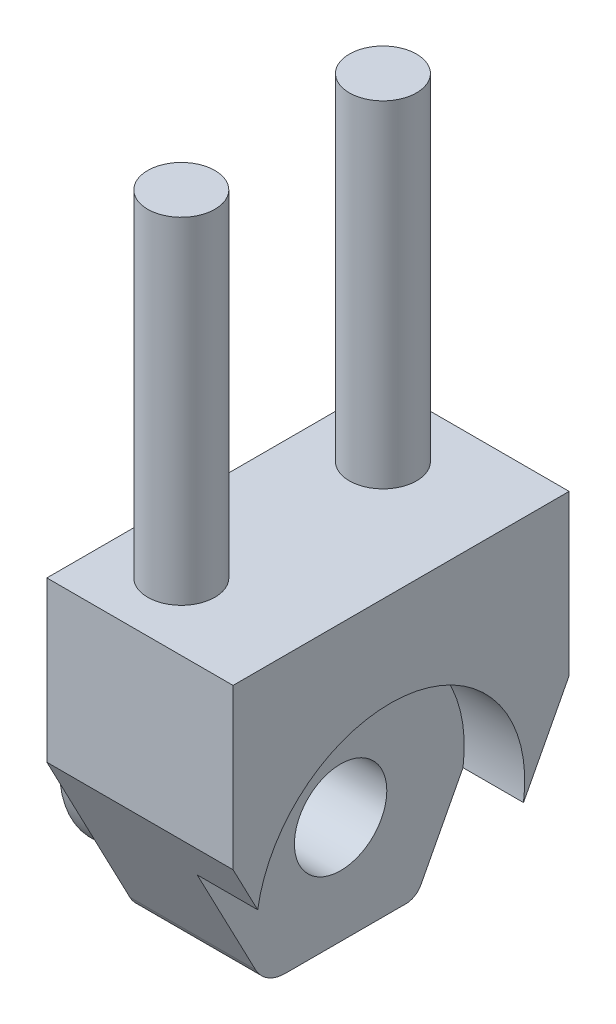
ISO-10303-21;
HEADER;
FILE_DESCRIPTION(('STEP AP214'),'2;1');
FILE_NAME('part.step','',(''),(''),'','','');
FILE_SCHEMA(('AUTOMOTIVE_DESIGN { 1 0 10303 214 1 1 1 1 }'));
ENDSEC;
DATA;
#1=APPLICATION_CONTEXT('core data for automotive mechanical design processes');
#2=APPLICATION_PROTOCOL_DEFINITION('international standard','automotive_design',2000,#1);
#3=PRODUCT_CONTEXT('',#1,'mechanical');
#4=PRODUCT('Part','Part','',(#3));
#5=PRODUCT_RELATED_PRODUCT_CATEGORY('part','',(#4));
#6=PRODUCT_DEFINITION_FORMATION('','',#4);
#7=PRODUCT_DEFINITION_CONTEXT('part definition',#1,'design');
#8=PRODUCT_DEFINITION('design','',#6,#7);
#9=PRODUCT_DEFINITION_SHAPE('','',#8);
#10=(LENGTH_UNIT() NAMED_UNIT(*) SI_UNIT(.MILLI.,.METRE.));
#11=(NAMED_UNIT(*) PLANE_ANGLE_UNIT() SI_UNIT($,.RADIAN.));
#12=(NAMED_UNIT(*) SI_UNIT($,.STERADIAN.) SOLID_ANGLE_UNIT());
#13=UNCERTAINTY_MEASURE_WITH_UNIT(LENGTH_MEASURE(1.E-05),#10,'distance_accuracy_value','');
#14=(GEOMETRIC_REPRESENTATION_CONTEXT(3) GLOBAL_UNCERTAINTY_ASSIGNED_CONTEXT((#13)) GLOBAL_UNIT_ASSIGNED_CONTEXT((#10,
#11,#12)) REPRESENTATION_CONTEXT('',''));
#15=CARTESIAN_POINT('',(0.,0.,0.));
#16=DIRECTION('',(0.,0.,1.));
#17=DIRECTION('',(1.,0.,0.));
#18=AXIS2_PLACEMENT_3D('',#15,#16,#17);
#19=CARTESIAN_POINT('',(30.7741068663053,12.8,1.65080050703637));
#20=DIRECTION('',(1.,0.,0.));
#21=DIRECTION('',(0.,0.,-1.));
#22=AXIS2_PLACEMENT_3D('',#19,#20,#21);
#23=PLANE('',#22);
#24=DIRECTION('',(0.,0.,-1.));
#25=VECTOR('',#24,1.);
#26=CARTESIAN_POINT('',(30.7741068663053,0.,0.));
#27=LINE('',#26,#25);
#28=CARTESIAN_POINT('',(30.7741068663053,0.,6.94763686889959));
#29=VERTEX_POINT('',#28);
#30=CARTESIAN_POINT('',(30.7741068663053,0.,-7.42192336474054));
#31=VERTEX_POINT('',#30);
#32=EDGE_CURVE('E177',#29,#31,#27,.T.);
#33=ORIENTED_EDGE('',*,*,#32,.T.);
#34=CARTESIAN_POINT('',(30.7741068663053,2.,-7.42192336474054));
#35=DIRECTION('',(1.,0.,0.));
#36=DIRECTION('',(0.,0.,-1.));
#37=AXIS2_PLACEMENT_3D('',#34,#35,#36);
#38=CIRCLE('',#37,2.);
#39=CARTESIAN_POINT('',(30.7741068663053,1.07198601065888,-9.19358643530085));
#40=VERTEX_POINT('',#39);
#41=EDGE_CURVE('E58',#31,#40,#38,.T.);
#42=ORIENTED_EDGE('',*,*,#41,.T.);
#43=DIRECTION('',(0.,0.885831535280156,-0.464006994670556));
#44=VECTOR('',#43,1.);
#45=CARTESIAN_POINT('',(30.7741068663053,21.0000000000001,-19.6320699535272));
#46=LINE('',#45,#44);
#47=CARTESIAN_POINT('',(30.7741068663053,10.6330959486494,-14.2017868790101));
#48=VERTEX_POINT('',#47);
#49=EDGE_CURVE('E132',#48,#40,#46,.F.);
#50=ORIENTED_EDGE('',*,*,#49,.F.);
#51=CARTESIAN_POINT('',(30.7741068663053,12.8,1.65080050703637));
#52=DIRECTION('',(1.,0.,0.));
#53=DIRECTION('',(0.,0.,-1.));
#54=AXIS2_PLACEMENT_3D('',#51,#52,#53);
#55=CIRCLE('',#54,16.);
#56=CARTESIAN_POINT('',(30.7741068663053,15.4051410884042,17.4372896642083));
#57=VERTEX_POINT('',#56);
#58=EDGE_CURVE('E121',#48,#57,#55,.T.);
#59=ORIENTED_EDGE('',*,*,#58,.T.);
#60=DIRECTION('',(0.,-0.885831535280157,-0.464006994670556));
#61=VECTOR('',#60,1.);
#62=CARTESIAN_POINT('',(30.7741068663053,21.0000000000001,20.3679300464728));
#63=LINE('',#62,#61);
#64=CARTESIAN_POINT('',(30.7741068663053,2.14397202131778,10.4909630100202));
#65=VERTEX_POINT('',#64);
#66=EDGE_CURVE('E130',#65,#57,#63,.F.);
#67=ORIENTED_EDGE('',*,*,#66,.F.);
#68=CARTESIAN_POINT('',(30.7741068663053,4.,6.94763686889959));
#69=DIRECTION('',(1.,0.,0.));
#70=DIRECTION('',(0.,0.,-1.));
#71=AXIS2_PLACEMENT_3D('',#68,#69,#70);
#72=CIRCLE('',#71,4.);
#73=EDGE_CURVE('E164',#29,#65,#72,.F.);
#74=ORIENTED_EDGE('',*,*,#73,.F.);
#75=EDGE_LOOP('',(#33,#42,#50,#59,#67,#74));
#76=FACE_BOUND('',#75,.T.);
#77=CARTESIAN_POINT('',(30.7741068663053,12.8,0.367930046472828));
#78=DIRECTION('',(1.,0.,0.));
#79=DIRECTION('',(0.,0.,-1.));
#80=AXIS2_PLACEMENT_3D('',#77,#78,#79);
#81=CIRCLE('',#80,5.5);
#82=CARTESIAN_POINT('',(30.7741068663053,12.8,-5.13206995352717));
#83=VERTEX_POINT('',#82);
#84=EDGE_CURVE('E39',#83,#83,#81,.F.);
#85=ORIENTED_EDGE('',*,*,#84,.T.);
#86=EDGE_LOOP('',(#85));
#87=FACE_BOUND('',#86,.T.);
#88=ADVANCED_FACE('F35',(#76,#87),#23,.T.);
#89=CARTESIAN_POINT('',(0.,0.,0.));
#90=DIRECTION('',(0.,1.,0.));
#91=DIRECTION('',(0.,0.,1.));
#92=AXIS2_PLACEMENT_3D('',#89,#90,#91);
#93=PLANE('',#92);
#94=DIRECTION('',(0.,0.,1.));
#95=VECTOR('',#94,1.);
#96=CARTESIAN_POINT('',(15.8141068663053,0.,-19.6320699535272));
#97=LINE('',#96,#95);
#98=CARTESIAN_POINT('',(15.8141068663053,0.,-7.42192336474054));
#99=VERTEX_POINT('',#98);
#100=CARTESIAN_POINT('',(15.8141068663053,0.,6.94763686889959));
#101=VERTEX_POINT('',#100);
#102=EDGE_CURVE('E179',#99,#101,#97,.T.);
#103=ORIENTED_EDGE('',*,*,#102,.F.);
#104=DIRECTION('',(-1.,0.,0.));
#105=VECTOR('',#104,1.);
#106=CARTESIAN_POINT('',(30.7741068663053,0.,-7.42192336474054));
#107=LINE('',#106,#105);
#108=EDGE_CURVE('E168',#99,#31,#107,.F.);
#109=ORIENTED_EDGE('',*,*,#108,.T.);
#110=ORIENTED_EDGE('',*,*,#32,.F.);
#111=DIRECTION('',(1.,0.,0.));
#112=VECTOR('',#111,1.);
#113=CARTESIAN_POINT('',(15.8141068663053,0.,6.94763686889959));
#114=LINE('',#113,#112);
#115=EDGE_CURVE('E154',#29,#101,#114,.F.);
#116=ORIENTED_EDGE('',*,*,#115,.T.);
#117=EDGE_LOOP('',(#103,#109,#110,#116));
#118=FACE_BOUND('',#117,.T.);
#119=ADVANCED_FACE('F176',(#118),#93,.F.);
#120=CARTESIAN_POINT('',(15.8141068663053,21.0000000000001,-19.6320699535272));
#121=DIRECTION('',(0.,0.464006994670556,0.885831535280156));
#122=DIRECTION('',(-1.,0.,0.));
#123=AXIS2_PLACEMENT_3D('',#120,#121,#122);
#124=PLANE('',#123);
#125=ORIENTED_EDGE('',*,*,#49,.T.);
#126=DIRECTION('',(1.,0.,0.));
#127=VECTOR('',#126,1.);
#128=CARTESIAN_POINT('',(15.8141068663053,1.07198601065889,-9.19358643530085));
#129=LINE('',#128,#127);
#130=CARTESIAN_POINT('',(15.8141068663053,1.07198601065888,-9.19358643530085));
#131=VERTEX_POINT('',#130);
#132=EDGE_CURVE('E44',#40,#131,#129,.F.);
#133=ORIENTED_EDGE('',*,*,#132,.T.);
#134=DIRECTION('',(0.,0.885831535280156,-0.464006994670556));
#135=VECTOR('',#134,1.);
#136=CARTESIAN_POINT('',(15.8141068663053,21.0000000000001,-19.6320699535272));
#137=LINE('',#136,#135);
#138=CARTESIAN_POINT('',(15.8141068663053,21.0000000000001,-19.6320699535272));
#139=VERTEX_POINT('',#138);
#140=EDGE_CURVE('E150',#139,#131,#137,.F.);
#141=ORIENTED_EDGE('',*,*,#140,.F.);
#142=DIRECTION('',(-1.,0.,0.));
#143=VECTOR('',#142,1.);
#144=CARTESIAN_POINT('',(15.8141068663053,21.0000000000001,-19.6320699535272));
#145=LINE('',#144,#143);
#146=CARTESIAN_POINT('',(37.9741068663053,21.0000000000001,-19.6320699535272));
#147=VERTEX_POINT('',#146);
#148=EDGE_CURVE('E142',#147,#139,#145,.T.);
#149=ORIENTED_EDGE('',*,*,#148,.F.);
#150=DIRECTION('',(0.,-0.885831535280156,0.464006994670556));
#151=VECTOR('',#150,1.);
#152=CARTESIAN_POINT('',(37.9741068663053,21.0000000000001,-19.6320699535272));
#153=LINE('',#152,#151);
#154=CARTESIAN_POINT('',(37.9741068663053,10.6330959486494,-14.2017868790101));
#155=VERTEX_POINT('',#154);
#156=EDGE_CURVE('E152',#155,#147,#153,.F.);
#157=ORIENTED_EDGE('',*,*,#156,.F.);
#158=DIRECTION('',(1.,0.,0.));
#159=VECTOR('',#158,1.);
#160=CARTESIAN_POINT('',(30.7741068663053,10.6330959486494,-14.2017868790101));
#161=LINE('',#160,#159);
#162=EDGE_CURVE('E117',#48,#155,#161,.T.);
#163=ORIENTED_EDGE('',*,*,#162,.F.);
#164=EDGE_LOOP('',(#125,#133,#141,#149,#157,#163));
#165=FACE_BOUND('',#164,.T.);
#166=ADVANCED_FACE('F246',(#165),#124,.F.);
#167=CARTESIAN_POINT('',(37.9741068663053,40.,-19.6320699535272));
#168=DIRECTION('',(-1.,0.,0.));
#169=DIRECTION('',(0.,0.,1.));
#170=AXIS2_PLACEMENT_3D('',#167,#168,#169);
#171=PLANE('',#170);
#172=DIRECTION('',(0.,0.885831535280157,0.464006994670556));
#173=VECTOR('',#172,1.);
#174=CARTESIAN_POINT('',(37.9741068663053,21.0000000000001,20.3679300464728));
#175=LINE('',#174,#173);
#176=CARTESIAN_POINT('',(37.9741068663053,21.0000000000002,20.3679300464728));
#177=VERTEX_POINT('',#176);
#178=CARTESIAN_POINT('',(37.9741068663053,15.4051410884042,17.4372896642083));
#179=VERTEX_POINT('',#178);
#180=EDGE_CURVE('E127',#177,#179,#175,.F.);
#181=ORIENTED_EDGE('',*,*,#180,.T.);
#182=CARTESIAN_POINT('',(37.9741068663053,12.8,1.65080050703637));
#183=DIRECTION('',(1.,0.,0.));
#184=DIRECTION('',(0.,0.,-1.));
#185=AXIS2_PLACEMENT_3D('',#182,#183,#184);
#186=CIRCLE('',#185,16.);
#187=EDGE_CURVE('E110',#155,#179,#186,.T.);
#188=ORIENTED_EDGE('',*,*,#187,.F.);
#189=ORIENTED_EDGE('',*,*,#156,.T.);
#190=DIRECTION('',(0.,-1.,0.));
#191=VECTOR('',#190,1.);
#192=CARTESIAN_POINT('',(37.9741068663053,40.,-19.6320699535272));
#193=LINE('',#192,#191);
#194=CARTESIAN_POINT('',(37.9741068663053,40.,-19.6320699535272));
#195=VERTEX_POINT('',#194);
#196=EDGE_CURVE('E214',#195,#147,#193,.T.);
#197=ORIENTED_EDGE('',*,*,#196,.F.);
#198=DIRECTION('',(0.,0.,-1.));
#199=VECTOR('',#198,1.);
#200=CARTESIAN_POINT('',(37.9741068663053,40.,-19.6320699535272));
#201=LINE('',#200,#199);
#202=CARTESIAN_POINT('',(37.9741068663053,40.,20.3679300464728));
#203=VERTEX_POINT('',#202);
#204=EDGE_CURVE('E206',#203,#195,#201,.T.);
#205=ORIENTED_EDGE('',*,*,#204,.F.);
#206=DIRECTION('',(0.,-1.,0.));
#207=VECTOR('',#206,1.);
#208=CARTESIAN_POINT('',(37.9741068663053,40.,20.3679300464728));
#209=LINE('',#208,#207);
#210=EDGE_CURVE('E138',#203,#177,#209,.T.);
#211=ORIENTED_EDGE('',*,*,#210,.T.);
#212=EDGE_LOOP('',(#181,#188,#189,#197,#205,#211));
#213=FACE_BOUND('',#212,.T.);
#214=ADVANCED_FACE('F135',(#213),#171,.F.);
#215=CARTESIAN_POINT('',(0.,4.,6.94763686889959));
#216=DIRECTION('',(-1.,0.,0.));
#217=DIRECTION('',(0.,0.,1.));
#218=AXIS2_PLACEMENT_3D('',#215,#216,#217);
#219=CYLINDRICAL_SURFACE('',#218,4.);
#220=ORIENTED_EDGE('',*,*,#115,.F.);
#221=ORIENTED_EDGE('',*,*,#73,.T.);
#222=DIRECTION('',(-1.,0.,0.));
#223=VECTOR('',#222,1.);
#224=CARTESIAN_POINT('',(37.9741068663053,2.14397202131778,10.4909630100202));
#225=LINE('',#224,#223);
#226=CARTESIAN_POINT('',(15.8141068663053,2.14397202131777,10.4909630100202));
#227=VERTEX_POINT('',#226);
#228=EDGE_CURVE('E159',#227,#65,#225,.F.);
#229=ORIENTED_EDGE('',*,*,#228,.F.);
#230=CARTESIAN_POINT('',(15.8141068663053,4.,6.94763686889959));
#231=DIRECTION('',(1.,0.,0.));
#232=DIRECTION('',(0.,0.,-1.));
#233=AXIS2_PLACEMENT_3D('',#230,#231,#232);
#234=CIRCLE('',#233,4.);
#235=EDGE_CURVE('E157',#101,#227,#234,.F.);
#236=ORIENTED_EDGE('',*,*,#235,.F.);
#237=EDGE_LOOP('',(#220,#221,#229,#236));
#238=FACE_BOUND('',#237,.T.);
#239=ADVANCED_FACE('F227',(#238),#219,.T.);
#240=CARTESIAN_POINT('',(15.8141068663053,40.,-19.6320699535272));
#241=DIRECTION('',(1.,0.,0.));
#242=DIRECTION('',(0.,0.,-1.));
#243=AXIS2_PLACEMENT_3D('',#240,#241,#242);
#244=PLANE('',#243);
#245=ORIENTED_EDGE('',*,*,#140,.T.);
#246=CARTESIAN_POINT('',(15.8141068663053,2.,-7.42192336474054));
#247=DIRECTION('',(1.,0.,0.));
#248=DIRECTION('',(0.,0.,-1.));
#249=AXIS2_PLACEMENT_3D('',#246,#247,#248);
#250=CIRCLE('',#249,2.);
#251=EDGE_CURVE('E11',#131,#99,#250,.F.);
#252=ORIENTED_EDGE('',*,*,#251,.T.);
#253=ORIENTED_EDGE('',*,*,#102,.T.);
#254=ORIENTED_EDGE('',*,*,#235,.T.);
#255=DIRECTION('',(0.,-0.885831535280157,-0.464006994670556));
#256=VECTOR('',#255,1.);
#257=CARTESIAN_POINT('',(15.8141068663053,21.0000000000001,20.3679300464728));
#258=LINE('',#257,#256);
#259=CARTESIAN_POINT('',(15.8141068663053,21.0000000000002,20.3679300464728));
#260=VERTEX_POINT('',#259);
#261=EDGE_CURVE('E139',#227,#260,#258,.F.);
#262=ORIENTED_EDGE('',*,*,#261,.T.);
#263=DIRECTION('',(0.,-1.,0.));
#264=VECTOR('',#263,1.);
#265=CARTESIAN_POINT('',(15.8141068663053,40.,20.3679300464728));
#266=LINE('',#265,#264);
#267=CARTESIAN_POINT('',(15.8141068663053,40.,20.3679300464728));
#268=VERTEX_POINT('',#267);
#269=EDGE_CURVE('E144',#268,#260,#266,.T.);
#270=ORIENTED_EDGE('',*,*,#269,.F.);
#271=DIRECTION('',(0.,0.,1.));
#272=VECTOR('',#271,1.);
#273=CARTESIAN_POINT('',(15.8141068663053,40.,-19.6320699535272));
#274=LINE('',#273,#272);
#275=CARTESIAN_POINT('',(15.8141068663053,40.,-19.6320699535272));
#276=VERTEX_POINT('',#275);
#277=EDGE_CURVE('E201',#276,#268,#274,.T.);
#278=ORIENTED_EDGE('',*,*,#277,.F.);
#279=DIRECTION('',(0.,-1.,0.));
#280=VECTOR('',#279,1.);
#281=CARTESIAN_POINT('',(15.8141068663053,40.,-19.6320699535272));
#282=LINE('',#281,#280);
#283=EDGE_CURVE('E210',#276,#139,#282,.T.);
#284=ORIENTED_EDGE('',*,*,#283,.T.);
#285=EDGE_LOOP('',(#245,#252,#253,#254,#262,#270,#278,#284));
#286=FACE_BOUND('',#285,.T.);
#287=CARTESIAN_POINT('',(15.8141068663053,13.5,0.367930046472834));
#288=DIRECTION('',(1.,0.,0.));
#289=DIRECTION('',(0.,0.,-1.));
#290=AXIS2_PLACEMENT_3D('',#287,#288,#289);
#291=CIRCLE('',#290,12.5);
#292=CARTESIAN_POINT('',(15.8141068663053,13.5,-12.1320699535272));
#293=VERTEX_POINT('',#292);
#294=EDGE_CURVE('E161',#293,#293,#291,.F.);
#295=ORIENTED_EDGE('',*,*,#294,.F.);
#296=EDGE_LOOP('',(#295));
#297=FACE_BOUND('',#296,.T.);
#298=ADVANCED_FACE('F228',(#286,#297),#244,.F.);
#299=CARTESIAN_POINT('',(0.,40.,0.));
#300=DIRECTION('',(0.,1.,0.));
#301=DIRECTION('',(0.,0.,1.));
#302=AXIS2_PLACEMENT_3D('',#299,#300,#301);
#303=PLANE('',#302);
#304=CARTESIAN_POINT('',(23.8141068663053,40.,-11.6320699535272));
#305=DIRECTION('',(0.,1.,0.));
#306=DIRECTION('',(0.,0.,1.));
#307=AXIS2_PLACEMENT_3D('',#304,#305,#306);
#308=CIRCLE('',#307,4.);
#309=CARTESIAN_POINT('',(23.8141068663053,40.,-7.63206995352717));
#310=VERTEX_POINT('',#309);
#311=EDGE_CURVE('E193',#310,#310,#308,.T.);
#312=ORIENTED_EDGE('',*,*,#311,.F.);
#313=EDGE_LOOP('',(#312));
#314=FACE_BOUND('',#313,.T.);
#315=ORIENTED_EDGE('',*,*,#277,.T.);
#316=DIRECTION('',(1.,0.,0.));
#317=VECTOR('',#316,1.);
#318=CARTESIAN_POINT('',(15.8141068663053,40.,20.3679300464728));
#319=LINE('',#318,#317);
#320=EDGE_CURVE('E204',#268,#203,#319,.T.);
#321=ORIENTED_EDGE('',*,*,#320,.T.);
#322=ORIENTED_EDGE('',*,*,#204,.T.);
#323=DIRECTION('',(-1.,0.,0.));
#324=VECTOR('',#323,1.);
#325=CARTESIAN_POINT('',(15.8141068663053,40.,-19.6320699535272));
#326=LINE('',#325,#324);
#327=EDGE_CURVE('E208',#195,#276,#326,.T.);
#328=ORIENTED_EDGE('',*,*,#327,.T.);
#329=EDGE_LOOP('',(#315,#321,#322,#328));
#330=FACE_BOUND('',#329,.T.);
#331=CARTESIAN_POINT('',(23.8141068663053,40.,12.3679300464728));
#332=DIRECTION('',(0.,1.,0.));
#333=DIRECTION('',(0.,0.,1.));
#334=AXIS2_PLACEMENT_3D('',#331,#332,#333);
#335=CIRCLE('',#334,4.);
#336=CARTESIAN_POINT('',(23.8141068663053,40.,16.3679300464728));
#337=VERTEX_POINT('',#336);
#338=EDGE_CURVE('E189',#337,#337,#335,.T.);
#339=ORIENTED_EDGE('',*,*,#338,.F.);
#340=EDGE_LOOP('',(#339));
#341=FACE_BOUND('',#340,.T.);
#342=ADVANCED_FACE('F273',(#314,#330,#341),#303,.T.);
#343=CARTESIAN_POINT('',(15.8141068663053,40.,20.3679300464728));
#344=DIRECTION('',(0.,0.,-1.));
#345=DIRECTION('',(-1.,0.,0.));
#346=AXIS2_PLACEMENT_3D('',#343,#344,#345);
#347=PLANE('',#346);
#348=ORIENTED_EDGE('',*,*,#269,.T.);
#349=DIRECTION('',(1.,0.,0.));
#350=VECTOR('',#349,1.);
#351=CARTESIAN_POINT('',(15.8141068663053,21.0000000000001,20.3679300464728));
#352=LINE('',#351,#350);
#353=EDGE_CURVE('E140',#260,#177,#352,.T.);
#354=ORIENTED_EDGE('',*,*,#353,.T.);
#355=ORIENTED_EDGE('',*,*,#210,.F.);
#356=ORIENTED_EDGE('',*,*,#320,.F.);
#357=EDGE_LOOP('',(#348,#354,#355,#356));
#358=FACE_BOUND('',#357,.T.);
#359=ADVANCED_FACE('F220',(#358),#347,.F.);
#360=CARTESIAN_POINT('',(15.8141068663053,40.,-19.6320699535272));
#361=DIRECTION('',(0.,0.,1.));
#362=DIRECTION('',(1.,0.,0.));
#363=AXIS2_PLACEMENT_3D('',#360,#361,#362);
#364=PLANE('',#363);
#365=ORIENTED_EDGE('',*,*,#196,.T.);
#366=ORIENTED_EDGE('',*,*,#148,.T.);
#367=ORIENTED_EDGE('',*,*,#283,.F.);
#368=ORIENTED_EDGE('',*,*,#327,.F.);
#369=EDGE_LOOP('',(#365,#366,#367,#368));
#370=FACE_BOUND('',#369,.T.);
#371=ADVANCED_FACE('F277',(#370),#364,.F.);
#372=CARTESIAN_POINT('',(15.8141068663053,21.0000000000001,20.3679300464728));
#373=DIRECTION('',(0.,0.464006994670556,-0.885831535280156));
#374=DIRECTION('',(1.,0.,0.));
#375=AXIS2_PLACEMENT_3D('',#372,#373,#374);
#376=PLANE('',#375);
#377=DIRECTION('',(1.,0.,0.));
#378=VECTOR('',#377,1.);
#379=CARTESIAN_POINT('',(30.7741068663053,15.4051410884042,17.4372896642083));
#380=LINE('',#379,#378);
#381=EDGE_CURVE('E114',#179,#57,#380,.F.);
#382=ORIENTED_EDGE('',*,*,#381,.F.);
#383=ORIENTED_EDGE('',*,*,#180,.F.);
#384=ORIENTED_EDGE('',*,*,#353,.F.);
#385=ORIENTED_EDGE('',*,*,#261,.F.);
#386=ORIENTED_EDGE('',*,*,#228,.T.);
#387=ORIENTED_EDGE('',*,*,#66,.T.);
#388=EDGE_LOOP('',(#382,#383,#384,#385,#386,#387));
#389=FACE_BOUND('',#388,.T.);
#390=ADVANCED_FACE('F125',(#389),#376,.F.);
#391=CARTESIAN_POINT('',(23.8141068663053,80.,-11.6320699535272));
#392=DIRECTION('',(0.,-1.,0.));
#393=DIRECTION('',(0.,0.,-1.));
#394=AXIS2_PLACEMENT_3D('',#391,#392,#393);
#395=CYLINDRICAL_SURFACE('',#394,4.);
#396=CARTESIAN_POINT('',(23.8141068663053,80.,-11.6320699535272));
#397=DIRECTION('',(0.,1.,0.));
#398=DIRECTION('',(0.,0.,1.));
#399=AXIS2_PLACEMENT_3D('',#396,#397,#398);
#400=CIRCLE('',#399,4.);
#401=CARTESIAN_POINT('',(23.8141068663053,80.,-7.63206995352717));
#402=VERTEX_POINT('',#401);
#403=EDGE_CURVE('E196',#402,#402,#400,.T.);
#404=ORIENTED_EDGE('',*,*,#403,.F.);
#405=EDGE_LOOP('',(#404));
#406=FACE_BOUND('',#405,.T.);
#407=ORIENTED_EDGE('',*,*,#311,.T.);
#408=EDGE_LOOP('',(#407));
#409=FACE_BOUND('',#408,.T.);
#410=ADVANCED_FACE('F268',(#406,#409),#395,.T.);
#411=CARTESIAN_POINT('',(23.8141068663053,80.,-11.6320699535272));
#412=DIRECTION('',(0.,1.,0.));
#413=DIRECTION('',(0.,0.,1.));
#414=AXIS2_PLACEMENT_3D('',#411,#412,#413);
#415=PLANE('',#414);
#416=ORIENTED_EDGE('',*,*,#403,.T.);
#417=EDGE_LOOP('',(#416));
#418=FACE_BOUND('',#417,.T.);
#419=ADVANCED_FACE('F264',(#418),#415,.T.);
#420=CARTESIAN_POINT('',(23.8141068663053,80.,12.3679300464728));
#421=DIRECTION('',(0.,-1.,0.));
#422=DIRECTION('',(0.,0.,-1.));
#423=AXIS2_PLACEMENT_3D('',#420,#421,#422);
#424=CYLINDRICAL_SURFACE('',#423,4.);
#425=CARTESIAN_POINT('',(23.8141068663053,80.,12.3679300464728));
#426=DIRECTION('',(0.,1.,0.));
#427=DIRECTION('',(0.,0.,1.));
#428=AXIS2_PLACEMENT_3D('',#425,#426,#427);
#429=CIRCLE('',#428,4.);
#430=CARTESIAN_POINT('',(23.8141068663053,80.,16.3679300464728));
#431=VERTEX_POINT('',#430);
#432=EDGE_CURVE('E190',#431,#431,#429,.T.);
#433=ORIENTED_EDGE('',*,*,#432,.F.);
#434=EDGE_LOOP('',(#433));
#435=FACE_BOUND('',#434,.T.);
#436=ORIENTED_EDGE('',*,*,#338,.T.);
#437=EDGE_LOOP('',(#436));
#438=FACE_BOUND('',#437,.T.);
#439=ADVANCED_FACE('F260',(#435,#438),#424,.T.);
#440=CARTESIAN_POINT('',(23.8141068663053,80.,12.3679300464728));
#441=DIRECTION('',(0.,1.,0.));
#442=DIRECTION('',(0.,0.,1.));
#443=AXIS2_PLACEMENT_3D('',#440,#441,#442);
#444=PLANE('',#443);
#445=ORIENTED_EDGE('',*,*,#432,.T.);
#446=EDGE_LOOP('',(#445));
#447=FACE_BOUND('',#446,.T.);
#448=ADVANCED_FACE('F256',(#447),#444,.T.);
#449=CARTESIAN_POINT('',(9.81410686630526,13.5,0.367930046472835));
#450=DIRECTION('',(1.,0.,0.));
#451=DIRECTION('',(0.,0.,-1.));
#452=AXIS2_PLACEMENT_3D('',#449,#450,#451);
#453=CYLINDRICAL_SURFACE('',#452,12.5);
#454=CARTESIAN_POINT('',(9.81410686630526,13.5,0.367930046472835));
#455=DIRECTION('',(-1.,0.,0.));
#456=DIRECTION('',(0.,0.,1.));
#457=AXIS2_PLACEMENT_3D('',#454,#455,#456);
#458=CIRCLE('',#457,12.5);
#459=CARTESIAN_POINT('',(9.81410686630526,13.5,12.8679300464728));
#460=VERTEX_POINT('',#459);
#461=EDGE_CURVE('E131',#460,#460,#458,.T.);
#462=ORIENTED_EDGE('',*,*,#461,.F.);
#463=EDGE_LOOP('',(#462));
#464=FACE_BOUND('',#463,.T.);
#465=ORIENTED_EDGE('',*,*,#294,.T.);
#466=EDGE_LOOP('',(#465));
#467=FACE_BOUND('',#466,.T.);
#468=ADVANCED_FACE('F252',(#464,#467),#453,.T.);
#469=CARTESIAN_POINT('',(9.81410686630526,13.5,0.367930046472835));
#470=DIRECTION('',(-1.,0.,0.));
#471=DIRECTION('',(0.,0.,1.));
#472=AXIS2_PLACEMENT_3D('',#469,#470,#471);
#473=PLANE('',#472);
#474=ORIENTED_EDGE('',*,*,#461,.T.);
#475=EDGE_LOOP('',(#474));
#476=FACE_BOUND('',#475,.T.);
#477=ADVANCED_FACE('F239',(#476),#473,.T.);
#478=CARTESIAN_POINT('',(30.7741068663053,12.8,1.65080050703637));
#479=DIRECTION('',(1.,0.,0.));
#480=DIRECTION('',(0.,0.,-1.));
#481=AXIS2_PLACEMENT_3D('',#478,#479,#480);
#482=CYLINDRICAL_SURFACE('',#481,16.);
#483=ORIENTED_EDGE('',*,*,#381,.T.);
#484=ORIENTED_EDGE('',*,*,#58,.F.);
#485=ORIENTED_EDGE('',*,*,#162,.T.);
#486=ORIENTED_EDGE('',*,*,#187,.T.);
#487=EDGE_LOOP('',(#483,#484,#485,#486));
#488=FACE_BOUND('',#487,.T.);
#489=ADVANCED_FACE('F112',(#488),#482,.F.);
#490=CARTESIAN_POINT('',(0.,2.,-7.42192336474054));
#491=DIRECTION('',(1.,0.,0.));
#492=DIRECTION('',(0.,0.,-1.));
#493=AXIS2_PLACEMENT_3D('',#490,#491,#492);
#494=CYLINDRICAL_SURFACE('',#493,2.);
#495=ORIENTED_EDGE('',*,*,#251,.F.);
#496=ORIENTED_EDGE('',*,*,#132,.F.);
#497=ORIENTED_EDGE('',*,*,#41,.F.);
#498=ORIENTED_EDGE('',*,*,#108,.F.);
#499=EDGE_LOOP('',(#495,#496,#497,#498));
#500=FACE_BOUND('',#499,.T.);
#501=ADVANCED_FACE('F37',(#500),#494,.T.);
#502=CARTESIAN_POINT('',(22.9741068663053,12.8,0.367930046472828));
#503=DIRECTION('',(1.,0.,0.));
#504=DIRECTION('',(0.,0.,-1.));
#505=AXIS2_PLACEMENT_3D('',#502,#503,#504);
#506=CYLINDRICAL_SURFACE('',#505,5.5);
#507=ORIENTED_EDGE('',*,*,#84,.F.);
#508=EDGE_LOOP('',(#507));
#509=FACE_BOUND('',#508,.T.);
#510=CARTESIAN_POINT('',(22.9741068663053,12.8,0.367930046472828));
#511=DIRECTION('',(-1.,0.,0.));
#512=DIRECTION('',(0.,0.,1.));
#513=AXIS2_PLACEMENT_3D('',#510,#511,#512);
#514=CIRCLE('',#513,5.5);
#515=CARTESIAN_POINT('',(22.9741068663053,12.8,5.86793004647282));
#516=VERTEX_POINT('',#515);
#517=EDGE_CURVE('E387',#516,#516,#514,.T.);
#518=ORIENTED_EDGE('',*,*,#517,.T.);
#519=EDGE_LOOP('',(#518));
#520=FACE_BOUND('',#519,.T.);
#521=ADVANCED_FACE('F231',(#509,#520),#506,.F.);
#522=CARTESIAN_POINT('',(22.9741068663053,12.8,0.367930046472828));
#523=DIRECTION('',(-1.,0.,0.));
#524=DIRECTION('',(0.,0.,1.));
#525=AXIS2_PLACEMENT_3D('',#522,#523,#524);
#526=PLANE('',#525);
#527=ORIENTED_EDGE('',*,*,#517,.F.);
#528=EDGE_LOOP('',(#527));
#529=FACE_BOUND('',#528,.T.);
#530=ADVANCED_FACE('F236',(#529),#526,.F.);
#531=CLOSED_SHELL('',(#88,#119,#166,#214,#239,#298,#342,#359,#371,#390,#410,#419,#439,#448,#468,
#477,#489,#501,#521,#530));
#532=MANIFOLD_SOLID_BREP('B2',#531);
#533=ADVANCED_BREP_SHAPE_REPRESENTATION('',(#18,#532),#14);
#534=SHAPE_DEFINITION_REPRESENTATION(#9,#533);
ENDSEC;
END-ISO-10303-21;
